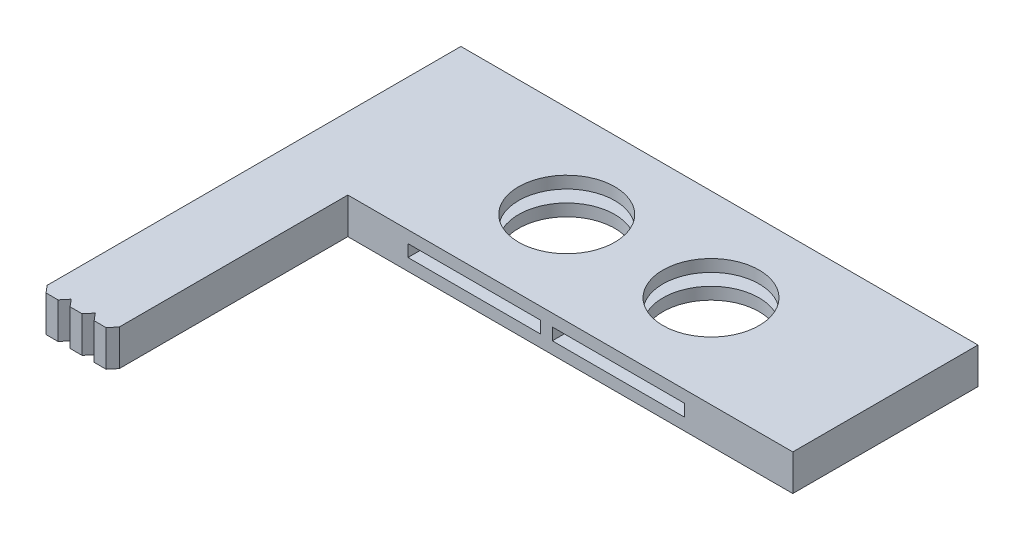
ISO-10303-21;
HEADER;
FILE_DESCRIPTION(('STEP AP214'),'2;1');
FILE_NAME('part.step','',(''),(''),'','','');
FILE_SCHEMA(('AUTOMOTIVE_DESIGN { 1 0 10303 214 1 1 1 1 }'));
ENDSEC;
DATA;
#1=APPLICATION_CONTEXT('core data for automotive mechanical design processes');
#2=APPLICATION_PROTOCOL_DEFINITION('international standard','automotive_design',2000,#1);
#3=PRODUCT_CONTEXT('',#1,'mechanical');
#4=PRODUCT('Part','Part','',(#3));
#5=PRODUCT_RELATED_PRODUCT_CATEGORY('part','',(#4));
#6=PRODUCT_DEFINITION_FORMATION('','',#4);
#7=PRODUCT_DEFINITION_CONTEXT('part definition',#1,'design');
#8=PRODUCT_DEFINITION('design','',#6,#7);
#9=PRODUCT_DEFINITION_SHAPE('','',#8);
#10=(LENGTH_UNIT() NAMED_UNIT(*) SI_UNIT(.MILLI.,.METRE.));
#11=(NAMED_UNIT(*) PLANE_ANGLE_UNIT() SI_UNIT($,.RADIAN.));
#12=(NAMED_UNIT(*) SI_UNIT($,.STERADIAN.) SOLID_ANGLE_UNIT());
#13=UNCERTAINTY_MEASURE_WITH_UNIT(LENGTH_MEASURE(1.E-05),#10,'distance_accuracy_value','');
#14=(GEOMETRIC_REPRESENTATION_CONTEXT(3) GLOBAL_UNCERTAINTY_ASSIGNED_CONTEXT((#13)) GLOBAL_UNIT_ASSIGNED_CONTEXT((#10,
#11,#12)) REPRESENTATION_CONTEXT('',''));
#15=CARTESIAN_POINT('',(0.,0.,0.));
#16=DIRECTION('',(0.,0.,1.));
#17=DIRECTION('',(1.,0.,0.));
#18=AXIS2_PLACEMENT_3D('',#15,#16,#17);
#19=CARTESIAN_POINT('',(16.5,3.,0.));
#20=DIRECTION('',(0.,-1.,0.));
#21=DIRECTION('',(0.,0.,-1.));
#22=AXIS2_PLACEMENT_3D('',#19,#20,#21);
#23=CYLINDRICAL_SURFACE('',#22,4.);
#24=CARTESIAN_POINT('',(16.5,2.,0.));
#25=DIRECTION('',(0.,1.,0.));
#26=DIRECTION('',(-1.,0.,0.));
#27=AXIS2_PLACEMENT_3D('',#24,#25,#26);
#28=CIRCLE('',#27,4.);
#29=CARTESIAN_POINT('',(12.5,2.,0.));
#30=VERTEX_POINT('',#29);
#31=EDGE_CURVE('E38',#30,#30,#28,.T.);
#32=ORIENTED_EDGE('',*,*,#31,.F.);
#33=EDGE_LOOP('',(#32));
#34=FACE_BOUND('',#33,.T.);
#35=CARTESIAN_POINT('',(16.5,3.,0.));
#36=DIRECTION('',(0.,1.,0.));
#37=DIRECTION('',(0.,0.,1.));
#38=AXIS2_PLACEMENT_3D('',#35,#36,#37);
#39=CIRCLE('',#38,4.);
#40=CARTESIAN_POINT('',(16.5,3.,4.));
#41=VERTEX_POINT('',#40);
#42=EDGE_CURVE('E255',#41,#41,#39,.T.);
#43=ORIENTED_EDGE('',*,*,#42,.T.);
#44=EDGE_LOOP('',(#43));
#45=FACE_BOUND('',#44,.T.);
#46=ADVANCED_FACE('F34',(#34,#45),#23,.F.);
#47=CARTESIAN_POINT('',(28.5,3.,0.));
#48=DIRECTION('',(0.,-1.,0.));
#49=DIRECTION('',(0.,0.,-1.));
#50=AXIS2_PLACEMENT_3D('',#47,#48,#49);
#51=CYLINDRICAL_SURFACE('',#50,4.);
#52=CARTESIAN_POINT('',(28.5,2.,0.));
#53=DIRECTION('',(0.,1.,0.));
#54=DIRECTION('',(-1.,0.,0.));
#55=AXIS2_PLACEMENT_3D('',#52,#53,#54);
#56=CIRCLE('',#55,4.);
#57=CARTESIAN_POINT('',(24.5,2.,0.));
#58=VERTEX_POINT('',#57);
#59=EDGE_CURVE('E358',#58,#58,#56,.T.);
#60=ORIENTED_EDGE('',*,*,#59,.F.);
#61=EDGE_LOOP('',(#60));
#62=FACE_BOUND('',#61,.T.);
#63=CARTESIAN_POINT('',(28.5,3.,0.));
#64=DIRECTION('',(0.,1.,0.));
#65=DIRECTION('',(0.,0.,1.));
#66=AXIS2_PLACEMENT_3D('',#63,#64,#65);
#67=CIRCLE('',#66,4.);
#68=CARTESIAN_POINT('',(28.5,3.,4.));
#69=VERTEX_POINT('',#68);
#70=EDGE_CURVE('E248',#69,#69,#67,.T.);
#71=ORIENTED_EDGE('',*,*,#70,.T.);
#72=EDGE_LOOP('',(#71));
#73=FACE_BOUND('',#72,.T.);
#74=ADVANCED_FACE('F372',(#62,#73),#51,.F.);
#75=CARTESIAN_POINT('',(0.,3.,0.));
#76=DIRECTION('',(0.,1.,0.));
#77=DIRECTION('',(0.,0.,1.));
#78=AXIS2_PLACEMENT_3D('',#75,#76,#77);
#79=PLANE('',#78);
#80=ORIENTED_EDGE('',*,*,#42,.F.);
#81=EDGE_LOOP('',(#80));
#82=FACE_BOUND('',#81,.T.);
#83=DIRECTION('',(-1.,0.,0.));
#84=VECTOR('',#83,1.);
#85=CARTESIAN_POINT('',(43.,3.,-7.7));
#86=LINE('',#85,#84);
#87=CARTESIAN_POINT('',(43.,3.,-7.7));
#88=VERTEX_POINT('',#87);
#89=CARTESIAN_POINT('',(0.,3.,-7.69999999999999));
#90=VERTEX_POINT('',#89);
#91=EDGE_CURVE('E261',#88,#90,#86,.T.);
#92=ORIENTED_EDGE('',*,*,#91,.T.);
#93=DIRECTION('',(0.,0.,1.));
#94=VECTOR('',#93,1.);
#95=CARTESIAN_POINT('',(0.,3.,-7.69999999999999));
#96=LINE('',#95,#94);
#97=CARTESIAN_POINT('',(0.,3.,26.7));
#98=VERTEX_POINT('',#97);
#99=EDGE_CURVE('E264',#90,#98,#96,.T.);
#100=ORIENTED_EDGE('',*,*,#99,.T.);
#101=DIRECTION('',(0.640868523132756,0.,0.76765066016883));
#102=VECTOR('',#101,1.);
#103=CARTESIAN_POINT('',(0.,3.,26.7));
#104=LINE('',#103,#102);
#105=CARTESIAN_POINT('',(0.500906380768423,3.,27.3));
#106=VERTEX_POINT('',#105);
#107=EDGE_CURVE('E267',#98,#106,#104,.T.);
#108=ORIENTED_EDGE('',*,*,#107,.T.);
#109=DIRECTION('',(1.,0.,0.));
#110=VECTOR('',#109,1.);
#111=CARTESIAN_POINT('',(0.500906380768423,3.,27.3));
#112=LINE('',#111,#110);
#113=CARTESIAN_POINT('',(1.49909361923161,3.,27.3));
#114=VERTEX_POINT('',#113);
#115=EDGE_CURVE('E269',#106,#114,#112,.T.);
#116=ORIENTED_EDGE('',*,*,#115,.T.);
#117=DIRECTION('',(0.640868523132743,0.,-0.76765066016884));
#118=VECTOR('',#117,1.);
#119=CARTESIAN_POINT('',(2.00000000000001,3.,26.7));
#120=LINE('',#119,#118);
#121=CARTESIAN_POINT('',(2.00000000000001,3.,26.7));
#122=VERTEX_POINT('',#121);
#123=EDGE_CURVE('E271',#114,#122,#120,.T.);
#124=ORIENTED_EDGE('',*,*,#123,.T.);
#125=DIRECTION('',(0.640868523132738,0.,0.767650660168845));
#126=VECTOR('',#125,1.);
#127=CARTESIAN_POINT('',(2.00000000000001,3.,26.7));
#128=LINE('',#127,#126);
#129=CARTESIAN_POINT('',(2.50090638076841,3.,27.3));
#130=VERTEX_POINT('',#129);
#131=EDGE_CURVE('E273',#122,#130,#128,.T.);
#132=ORIENTED_EDGE('',*,*,#131,.T.);
#133=DIRECTION('',(1.,0.,0.));
#134=VECTOR('',#133,1.);
#135=CARTESIAN_POINT('',(2.50090638076841,3.,27.3));
#136=LINE('',#135,#134);
#137=CARTESIAN_POINT('',(3.49909361923159,3.,27.3));
#138=VERTEX_POINT('',#137);
#139=EDGE_CURVE('E275',#130,#138,#136,.T.);
#140=ORIENTED_EDGE('',*,*,#139,.T.);
#141=DIRECTION('',(0.64086852313275,0.,-0.767650660168835));
#142=VECTOR('',#141,1.);
#143=CARTESIAN_POINT('',(4.00000000000001,3.,26.7));
#144=LINE('',#143,#142);
#145=CARTESIAN_POINT('',(4.00000000000001,3.,26.7));
#146=VERTEX_POINT('',#145);
#147=EDGE_CURVE('E277',#138,#146,#144,.T.);
#148=ORIENTED_EDGE('',*,*,#147,.T.);
#149=DIRECTION('',(0.640868523132732,0.,0.76765066016885));
#150=VECTOR('',#149,1.);
#151=CARTESIAN_POINT('',(4.00000000000001,3.,26.7));
#152=LINE('',#151,#150);
#153=CARTESIAN_POINT('',(4.50090638076839,3.,27.3));
#154=VERTEX_POINT('',#153);
#155=EDGE_CURVE('E279',#146,#154,#152,.T.);
#156=ORIENTED_EDGE('',*,*,#155,.T.);
#157=DIRECTION('',(1.,0.,0.));
#158=VECTOR('',#157,1.);
#159=CARTESIAN_POINT('',(4.50090638076839,3.,27.3));
#160=LINE('',#159,#158);
#161=CARTESIAN_POINT('',(5.49909361923158,3.,27.3));
#162=VERTEX_POINT('',#161);
#163=EDGE_CURVE('E281',#154,#162,#160,.T.);
#164=ORIENTED_EDGE('',*,*,#163,.T.);
#165=DIRECTION('',(0.640868523132743,0.,-0.76765066016884));
#166=VECTOR('',#165,1.);
#167=CARTESIAN_POINT('',(5.99999999999998,3.,26.7));
#168=LINE('',#167,#166);
#169=CARTESIAN_POINT('',(5.99999999999998,3.,26.7));
#170=VERTEX_POINT('',#169);
#171=EDGE_CURVE('E283',#162,#170,#168,.T.);
#172=ORIENTED_EDGE('',*,*,#171,.T.);
#173=DIRECTION('',(0.,0.,-1.));
#174=VECTOR('',#173,1.);
#175=CARTESIAN_POINT('',(5.99999999999998,3.,26.7));
#176=LINE('',#175,#174);
#177=CARTESIAN_POINT('',(5.99999999999998,3.,7.7));
#178=VERTEX_POINT('',#177);
#179=EDGE_CURVE('E285',#170,#178,#176,.T.);
#180=ORIENTED_EDGE('',*,*,#179,.T.);
#181=DIRECTION('',(1.,0.,0.));
#182=VECTOR('',#181,1.);
#183=CARTESIAN_POINT('',(5.99999999999998,3.,7.7));
#184=LINE('',#183,#182);
#185=CARTESIAN_POINT('',(43.,3.,7.7));
#186=VERTEX_POINT('',#185);
#187=EDGE_CURVE('E287',#178,#186,#184,.T.);
#188=ORIENTED_EDGE('',*,*,#187,.T.);
#189=DIRECTION('',(0.,0.,-1.));
#190=VECTOR('',#189,1.);
#191=CARTESIAN_POINT('',(43.,3.,-7.7));
#192=LINE('',#191,#190);
#193=EDGE_CURVE('E289',#186,#88,#192,.T.);
#194=ORIENTED_EDGE('',*,*,#193,.T.);
#195=EDGE_LOOP('',(#92,#100,#108,#116,#124,#132,#140,#148,#156,#164,#172,#180,#188,#194));
#196=FACE_BOUND('',#195,.T.);
#197=ORIENTED_EDGE('',*,*,#70,.F.);
#198=EDGE_LOOP('',(#197));
#199=FACE_BOUND('',#198,.T.);
#200=ADVANCED_FACE('F377',(#82,#196,#199),#79,.T.);
#201=CARTESIAN_POINT('',(0.,0.,0.));
#202=DIRECTION('',(0.,1.,0.));
#203=DIRECTION('',(0.,0.,1.));
#204=AXIS2_PLACEMENT_3D('',#201,#202,#203);
#205=PLANE('',#204);
#206=DIRECTION('',(-1.,0.,0.));
#207=VECTOR('',#206,1.);
#208=CARTESIAN_POINT('',(43.,0.,-7.7));
#209=LINE('',#208,#207);
#210=CARTESIAN_POINT('',(43.,0.,-7.7));
#211=VERTEX_POINT('',#210);
#212=CARTESIAN_POINT('',(0.,0.,-7.69999999999999));
#213=VERTEX_POINT('',#212);
#214=EDGE_CURVE('E258',#211,#213,#209,.T.);
#215=ORIENTED_EDGE('',*,*,#214,.F.);
#216=DIRECTION('',(0.,0.,-1.));
#217=VECTOR('',#216,1.);
#218=CARTESIAN_POINT('',(43.,0.,-7.7));
#219=LINE('',#218,#217);
#220=CARTESIAN_POINT('',(43.,0.,7.7));
#221=VERTEX_POINT('',#220);
#222=EDGE_CURVE('E265',#221,#211,#219,.T.);
#223=ORIENTED_EDGE('',*,*,#222,.F.);
#224=DIRECTION('',(1.,0.,0.));
#225=VECTOR('',#224,1.);
#226=CARTESIAN_POINT('',(5.99999999999998,0.,7.7));
#227=LINE('',#226,#225);
#228=CARTESIAN_POINT('',(5.99999999999998,0.,7.7));
#229=VERTEX_POINT('',#228);
#230=EDGE_CURVE('E316',#229,#221,#227,.T.);
#231=ORIENTED_EDGE('',*,*,#230,.F.);
#232=DIRECTION('',(0.,0.,-1.));
#233=VECTOR('',#232,1.);
#234=CARTESIAN_POINT('',(5.99999999999998,0.,26.7));
#235=LINE('',#234,#233);
#236=CARTESIAN_POINT('',(5.99999999999998,0.,26.7));
#237=VERTEX_POINT('',#236);
#238=EDGE_CURVE('E314',#237,#229,#235,.T.);
#239=ORIENTED_EDGE('',*,*,#238,.F.);
#240=DIRECTION('',(0.640868523132743,0.,-0.76765066016884));
#241=VECTOR('',#240,1.);
#242=CARTESIAN_POINT('',(5.99999999999998,0.,26.7));
#243=LINE('',#242,#241);
#244=CARTESIAN_POINT('',(5.49909361923158,0.,27.3));
#245=VERTEX_POINT('',#244);
#246=EDGE_CURVE('E312',#245,#237,#243,.T.);
#247=ORIENTED_EDGE('',*,*,#246,.F.);
#248=DIRECTION('',(1.,0.,0.));
#249=VECTOR('',#248,1.);
#250=CARTESIAN_POINT('',(4.50090638076839,0.,27.3));
#251=LINE('',#250,#249);
#252=CARTESIAN_POINT('',(4.50090638076839,0.,27.3));
#253=VERTEX_POINT('',#252);
#254=EDGE_CURVE('E310',#253,#245,#251,.T.);
#255=ORIENTED_EDGE('',*,*,#254,.F.);
#256=DIRECTION('',(0.640868523132732,0.,0.76765066016885));
#257=VECTOR('',#256,1.);
#258=CARTESIAN_POINT('',(4.00000000000001,0.,26.7));
#259=LINE('',#258,#257);
#260=CARTESIAN_POINT('',(4.00000000000001,0.,26.7));
#261=VERTEX_POINT('',#260);
#262=EDGE_CURVE('E308',#261,#253,#259,.T.);
#263=ORIENTED_EDGE('',*,*,#262,.F.);
#264=DIRECTION('',(0.64086852313275,0.,-0.767650660168835));
#265=VECTOR('',#264,1.);
#266=CARTESIAN_POINT('',(4.00000000000001,0.,26.7));
#267=LINE('',#266,#265);
#268=CARTESIAN_POINT('',(3.49909361923159,0.,27.3));
#269=VERTEX_POINT('',#268);
#270=EDGE_CURVE('E306',#269,#261,#267,.T.);
#271=ORIENTED_EDGE('',*,*,#270,.F.);
#272=DIRECTION('',(1.,0.,0.));
#273=VECTOR('',#272,1.);
#274=CARTESIAN_POINT('',(2.50090638076841,0.,27.3));
#275=LINE('',#274,#273);
#276=CARTESIAN_POINT('',(2.50090638076841,0.,27.3));
#277=VERTEX_POINT('',#276);
#278=EDGE_CURVE('E304',#277,#269,#275,.T.);
#279=ORIENTED_EDGE('',*,*,#278,.F.);
#280=DIRECTION('',(0.640868523132738,0.,0.767650660168845));
#281=VECTOR('',#280,1.);
#282=CARTESIAN_POINT('',(2.00000000000001,0.,26.7));
#283=LINE('',#282,#281);
#284=CARTESIAN_POINT('',(2.00000000000001,0.,26.7));
#285=VERTEX_POINT('',#284);
#286=EDGE_CURVE('E302',#285,#277,#283,.T.);
#287=ORIENTED_EDGE('',*,*,#286,.F.);
#288=DIRECTION('',(0.640868523132743,0.,-0.76765066016884));
#289=VECTOR('',#288,1.);
#290=CARTESIAN_POINT('',(2.00000000000001,0.,26.7));
#291=LINE('',#290,#289);
#292=CARTESIAN_POINT('',(1.49909361923161,0.,27.3));
#293=VERTEX_POINT('',#292);
#294=EDGE_CURVE('E300',#293,#285,#291,.T.);
#295=ORIENTED_EDGE('',*,*,#294,.F.);
#296=DIRECTION('',(1.,0.,0.));
#297=VECTOR('',#296,1.);
#298=CARTESIAN_POINT('',(0.500906380768423,0.,27.3));
#299=LINE('',#298,#297);
#300=CARTESIAN_POINT('',(0.500906380768423,0.,27.3));
#301=VERTEX_POINT('',#300);
#302=EDGE_CURVE('E298',#301,#293,#299,.T.);
#303=ORIENTED_EDGE('',*,*,#302,.F.);
#304=DIRECTION('',(0.640868523132756,0.,0.76765066016883));
#305=VECTOR('',#304,1.);
#306=CARTESIAN_POINT('',(0.,0.,26.7));
#307=LINE('',#306,#305);
#308=CARTESIAN_POINT('',(0.,0.,26.7));
#309=VERTEX_POINT('',#308);
#310=EDGE_CURVE('E296',#309,#301,#307,.T.);
#311=ORIENTED_EDGE('',*,*,#310,.F.);
#312=DIRECTION('',(0.,0.,1.));
#313=VECTOR('',#312,1.);
#314=CARTESIAN_POINT('',(0.,0.,-7.69999999999999));
#315=LINE('',#314,#313);
#316=EDGE_CURVE('E294',#213,#309,#315,.T.);
#317=ORIENTED_EDGE('',*,*,#316,.F.);
#318=EDGE_LOOP('',(#215,#223,#231,#239,#247,#255,#263,#271,#279,#287,#295,#303,#311,#317));
#319=FACE_BOUND('',#318,.T.);
#320=CARTESIAN_POINT('',(16.5,0.,0.));
#321=DIRECTION('',(0.,1.,0.));
#322=DIRECTION('',(0.,0.,1.));
#323=AXIS2_PLACEMENT_3D('',#320,#321,#322);
#324=CIRCLE('',#323,4.);
#325=CARTESIAN_POINT('',(16.5,0.,4.));
#326=VERTEX_POINT('',#325);
#327=EDGE_CURVE('E251',#326,#326,#324,.T.);
#328=ORIENTED_EDGE('',*,*,#327,.T.);
#329=EDGE_LOOP('',(#328));
#330=FACE_BOUND('',#329,.T.);
#331=CARTESIAN_POINT('',(28.5,0.,0.));
#332=DIRECTION('',(0.,1.,0.));
#333=DIRECTION('',(0.,0.,1.));
#334=AXIS2_PLACEMENT_3D('',#331,#332,#333);
#335=CIRCLE('',#334,4.);
#336=CARTESIAN_POINT('',(28.5,0.,4.));
#337=VERTEX_POINT('',#336);
#338=EDGE_CURVE('E252',#337,#337,#335,.T.);
#339=ORIENTED_EDGE('',*,*,#338,.T.);
#340=EDGE_LOOP('',(#339));
#341=FACE_BOUND('',#340,.T.);
#342=ADVANCED_FACE('F380',(#319,#330,#341),#205,.F.);
#343=CARTESIAN_POINT('',(43.,3.,-7.7));
#344=DIRECTION('',(0.,0.,1.));
#345=DIRECTION('',(1.,0.,0.));
#346=AXIS2_PLACEMENT_3D('',#343,#344,#345);
#347=PLANE('',#346);
#348=ORIENTED_EDGE('',*,*,#214,.T.);
#349=DIRECTION('',(0.,-1.,0.));
#350=VECTOR('',#349,1.);
#351=CARTESIAN_POINT('',(0.,3.,-7.69999999999999));
#352=LINE('',#351,#350);
#353=EDGE_CURVE('E12',#90,#213,#352,.T.);
#354=ORIENTED_EDGE('',*,*,#353,.F.);
#355=ORIENTED_EDGE('',*,*,#91,.F.);
#356=DIRECTION('',(0.,-1.,0.));
#357=VECTOR('',#356,1.);
#358=CARTESIAN_POINT('',(43.,3.,-7.7));
#359=LINE('',#358,#357);
#360=EDGE_CURVE('E291',#88,#211,#359,.T.);
#361=ORIENTED_EDGE('',*,*,#360,.T.);
#362=EDGE_LOOP('',(#348,#354,#355,#361));
#363=FACE_BOUND('',#362,.T.);
#364=ADVANCED_FACE('F36',(#363),#347,.F.);
#365=CARTESIAN_POINT('',(0.,3.,-7.69999999999999));
#366=DIRECTION('',(1.,0.,0.));
#367=DIRECTION('',(0.,0.,-1.));
#368=AXIS2_PLACEMENT_3D('',#365,#366,#367);
#369=PLANE('',#368);
#370=ORIENTED_EDGE('',*,*,#316,.T.);
#371=DIRECTION('',(0.,-1.,0.));
#372=VECTOR('',#371,1.);
#373=CARTESIAN_POINT('',(0.,3.,26.7));
#374=LINE('',#373,#372);
#375=EDGE_CURVE('E43',#98,#309,#374,.T.);
#376=ORIENTED_EDGE('',*,*,#375,.F.);
#377=ORIENTED_EDGE('',*,*,#99,.F.);
#378=ORIENTED_EDGE('',*,*,#353,.T.);
#379=EDGE_LOOP('',(#370,#376,#377,#378));
#380=FACE_BOUND('',#379,.T.);
#381=ADVANCED_FACE('F415',(#380),#369,.F.);
#382=CARTESIAN_POINT('',(0.,3.,26.7));
#383=DIRECTION('',(0.76765066016883,0.,-0.640868523132756));
#384=DIRECTION('',(-0.640868523132756,0.,-0.76765066016883));
#385=AXIS2_PLACEMENT_3D('',#382,#383,#384);
#386=PLANE('',#385);
#387=ORIENTED_EDGE('',*,*,#310,.T.);
#388=DIRECTION('',(0.,-1.,0.));
#389=VECTOR('',#388,1.);
#390=CARTESIAN_POINT('',(0.500906380768423,3.,27.3));
#391=LINE('',#390,#389);
#392=EDGE_CURVE('E351',#106,#301,#391,.T.);
#393=ORIENTED_EDGE('',*,*,#392,.F.);
#394=ORIENTED_EDGE('',*,*,#107,.F.);
#395=ORIENTED_EDGE('',*,*,#375,.T.);
#396=EDGE_LOOP('',(#387,#393,#394,#395));
#397=FACE_BOUND('',#396,.T.);
#398=ADVANCED_FACE('F460',(#397),#386,.F.);
#399=CARTESIAN_POINT('',(0.500906380768423,3.,27.3));
#400=DIRECTION('',(0.,0.,-1.));
#401=DIRECTION('',(-1.,0.,0.));
#402=AXIS2_PLACEMENT_3D('',#399,#400,#401);
#403=PLANE('',#402);
#404=ORIENTED_EDGE('',*,*,#302,.T.);
#405=DIRECTION('',(0.,-1.,0.));
#406=VECTOR('',#405,1.);
#407=CARTESIAN_POINT('',(1.49909361923161,3.,27.3));
#408=LINE('',#407,#406);
#409=EDGE_CURVE('E348',#114,#293,#408,.T.);
#410=ORIENTED_EDGE('',*,*,#409,.F.);
#411=ORIENTED_EDGE('',*,*,#115,.F.);
#412=ORIENTED_EDGE('',*,*,#392,.T.);
#413=EDGE_LOOP('',(#404,#410,#411,#412));
#414=FACE_BOUND('',#413,.T.);
#415=ADVANCED_FACE('F456',(#414),#403,.F.);
#416=CARTESIAN_POINT('',(2.00000000000001,3.,26.7));
#417=DIRECTION('',(-0.76765066016884,0.,-0.640868523132743));
#418=DIRECTION('',(-0.640868523132743,0.,0.76765066016884));
#419=AXIS2_PLACEMENT_3D('',#416,#417,#418);
#420=PLANE('',#419);
#421=ORIENTED_EDGE('',*,*,#294,.T.);
#422=DIRECTION('',(0.,-1.,0.));
#423=VECTOR('',#422,1.);
#424=CARTESIAN_POINT('',(2.00000000000001,3.,26.7));
#425=LINE('',#424,#423);
#426=EDGE_CURVE('E345',#122,#285,#425,.T.);
#427=ORIENTED_EDGE('',*,*,#426,.F.);
#428=ORIENTED_EDGE('',*,*,#123,.F.);
#429=ORIENTED_EDGE('',*,*,#409,.T.);
#430=EDGE_LOOP('',(#421,#427,#428,#429));
#431=FACE_BOUND('',#430,.T.);
#432=ADVANCED_FACE('F452',(#431),#420,.F.);
#433=CARTESIAN_POINT('',(2.00000000000001,3.,26.7));
#434=DIRECTION('',(0.767650660168845,0.,-0.640868523132738));
#435=DIRECTION('',(-0.640868523132738,0.,-0.767650660168845));
#436=AXIS2_PLACEMENT_3D('',#433,#434,#435);
#437=PLANE('',#436);
#438=ORIENTED_EDGE('',*,*,#286,.T.);
#439=DIRECTION('',(0.,-1.,0.));
#440=VECTOR('',#439,1.);
#441=CARTESIAN_POINT('',(2.50090638076841,3.,27.3));
#442=LINE('',#441,#440);
#443=EDGE_CURVE('E342',#130,#277,#442,.T.);
#444=ORIENTED_EDGE('',*,*,#443,.F.);
#445=ORIENTED_EDGE('',*,*,#131,.F.);
#446=ORIENTED_EDGE('',*,*,#426,.T.);
#447=EDGE_LOOP('',(#438,#444,#445,#446));
#448=FACE_BOUND('',#447,.T.);
#449=ADVANCED_FACE('F448',(#448),#437,.F.);
#450=CARTESIAN_POINT('',(2.50090638076841,3.,27.3));
#451=DIRECTION('',(0.,0.,-1.));
#452=DIRECTION('',(-1.,0.,0.));
#453=AXIS2_PLACEMENT_3D('',#450,#451,#452);
#454=PLANE('',#453);
#455=ORIENTED_EDGE('',*,*,#278,.T.);
#456=DIRECTION('',(0.,-1.,0.));
#457=VECTOR('',#456,1.);
#458=CARTESIAN_POINT('',(3.49909361923159,3.,27.3));
#459=LINE('',#458,#457);
#460=EDGE_CURVE('E339',#138,#269,#459,.T.);
#461=ORIENTED_EDGE('',*,*,#460,.F.);
#462=ORIENTED_EDGE('',*,*,#139,.F.);
#463=ORIENTED_EDGE('',*,*,#443,.T.);
#464=EDGE_LOOP('',(#455,#461,#462,#463));
#465=FACE_BOUND('',#464,.T.);
#466=ADVANCED_FACE('F444',(#465),#454,.F.);
#467=CARTESIAN_POINT('',(4.00000000000001,3.,26.7));
#468=DIRECTION('',(-0.767650660168835,0.,-0.64086852313275));
#469=DIRECTION('',(-0.64086852313275,0.,0.767650660168835));
#470=AXIS2_PLACEMENT_3D('',#467,#468,#469);
#471=PLANE('',#470);
#472=ORIENTED_EDGE('',*,*,#270,.T.);
#473=DIRECTION('',(0.,-1.,0.));
#474=VECTOR('',#473,1.);
#475=CARTESIAN_POINT('',(4.00000000000001,3.,26.7));
#476=LINE('',#475,#474);
#477=EDGE_CURVE('E336',#146,#261,#476,.T.);
#478=ORIENTED_EDGE('',*,*,#477,.F.);
#479=ORIENTED_EDGE('',*,*,#147,.F.);
#480=ORIENTED_EDGE('',*,*,#460,.T.);
#481=EDGE_LOOP('',(#472,#478,#479,#480));
#482=FACE_BOUND('',#481,.T.);
#483=ADVANCED_FACE('F440',(#482),#471,.F.);
#484=CARTESIAN_POINT('',(4.00000000000001,3.,26.7));
#485=DIRECTION('',(0.76765066016885,0.,-0.640868523132732));
#486=DIRECTION('',(-0.640868523132732,0.,-0.76765066016885));
#487=AXIS2_PLACEMENT_3D('',#484,#485,#486);
#488=PLANE('',#487);
#489=ORIENTED_EDGE('',*,*,#262,.T.);
#490=DIRECTION('',(0.,-1.,0.));
#491=VECTOR('',#490,1.);
#492=CARTESIAN_POINT('',(4.50090638076839,3.,27.3));
#493=LINE('',#492,#491);
#494=EDGE_CURVE('E333',#154,#253,#493,.T.);
#495=ORIENTED_EDGE('',*,*,#494,.F.);
#496=ORIENTED_EDGE('',*,*,#155,.F.);
#497=ORIENTED_EDGE('',*,*,#477,.T.);
#498=EDGE_LOOP('',(#489,#495,#496,#497));
#499=FACE_BOUND('',#498,.T.);
#500=ADVANCED_FACE('F436',(#499),#488,.F.);
#501=CARTESIAN_POINT('',(4.50090638076839,3.,27.3));
#502=DIRECTION('',(0.,0.,-1.));
#503=DIRECTION('',(-1.,0.,0.));
#504=AXIS2_PLACEMENT_3D('',#501,#502,#503);
#505=PLANE('',#504);
#506=ORIENTED_EDGE('',*,*,#254,.T.);
#507=DIRECTION('',(0.,-1.,0.));
#508=VECTOR('',#507,1.);
#509=CARTESIAN_POINT('',(5.49909361923158,3.,27.3));
#510=LINE('',#509,#508);
#511=EDGE_CURVE('E330',#162,#245,#510,.T.);
#512=ORIENTED_EDGE('',*,*,#511,.F.);
#513=ORIENTED_EDGE('',*,*,#163,.F.);
#514=ORIENTED_EDGE('',*,*,#494,.T.);
#515=EDGE_LOOP('',(#506,#512,#513,#514));
#516=FACE_BOUND('',#515,.T.);
#517=ADVANCED_FACE('F432',(#516),#505,.F.);
#518=CARTESIAN_POINT('',(5.99999999999998,3.,26.7));
#519=DIRECTION('',(-0.76765066016884,0.,-0.640868523132743));
#520=DIRECTION('',(-0.640868523132743,0.,0.76765066016884));
#521=AXIS2_PLACEMENT_3D('',#518,#519,#520);
#522=PLANE('',#521);
#523=ORIENTED_EDGE('',*,*,#246,.T.);
#524=DIRECTION('',(0.,-1.,0.));
#525=VECTOR('',#524,1.);
#526=CARTESIAN_POINT('',(5.99999999999998,3.,26.7));
#527=LINE('',#526,#525);
#528=EDGE_CURVE('E327',#170,#237,#527,.T.);
#529=ORIENTED_EDGE('',*,*,#528,.F.);
#530=ORIENTED_EDGE('',*,*,#171,.F.);
#531=ORIENTED_EDGE('',*,*,#511,.T.);
#532=EDGE_LOOP('',(#523,#529,#530,#531));
#533=FACE_BOUND('',#532,.T.);
#534=ADVANCED_FACE('F428',(#533),#522,.F.);
#535=CARTESIAN_POINT('',(5.99999999999998,3.,26.7));
#536=DIRECTION('',(-1.,0.,0.));
#537=DIRECTION('',(0.,0.,1.));
#538=AXIS2_PLACEMENT_3D('',#535,#536,#537);
#539=PLANE('',#538);
#540=ORIENTED_EDGE('',*,*,#238,.T.);
#541=DIRECTION('',(0.,-1.,0.));
#542=VECTOR('',#541,1.);
#543=CARTESIAN_POINT('',(5.99999999999998,3.,7.7));
#544=LINE('',#543,#542);
#545=EDGE_CURVE('E324',#178,#229,#544,.T.);
#546=ORIENTED_EDGE('',*,*,#545,.F.);
#547=ORIENTED_EDGE('',*,*,#179,.F.);
#548=ORIENTED_EDGE('',*,*,#528,.T.);
#549=EDGE_LOOP('',(#540,#546,#547,#548));
#550=FACE_BOUND('',#549,.T.);
#551=ADVANCED_FACE('F425',(#550),#539,.F.);
#552=CARTESIAN_POINT('',(5.99999999999998,3.,7.7));
#553=DIRECTION('',(0.,0.,-1.));
#554=DIRECTION('',(-1.,0.,0.));
#555=AXIS2_PLACEMENT_3D('',#552,#553,#554);
#556=PLANE('',#555);
#557=DIRECTION('',(1.,0.,0.));
#558=VECTOR('',#557,1.);
#559=CARTESIAN_POINT('',(11.,1.,7.7));
#560=LINE('',#559,#558);
#561=CARTESIAN_POINT('',(11.,1.,7.7));
#562=VERTEX_POINT('',#561);
#563=CARTESIAN_POINT('',(22.,1.,7.7));
#564=VERTEX_POINT('',#563);
#565=EDGE_CURVE('E202',#562,#564,#560,.T.);
#566=ORIENTED_EDGE('',*,*,#565,.F.);
#567=DIRECTION('',(0.,-1.,0.));
#568=VECTOR('',#567,1.);
#569=CARTESIAN_POINT('',(11.,2.,7.7));
#570=LINE('',#569,#568);
#571=CARTESIAN_POINT('',(11.,2.,7.7));
#572=VERTEX_POINT('',#571);
#573=EDGE_CURVE('E51',#572,#562,#570,.T.);
#574=ORIENTED_EDGE('',*,*,#573,.F.);
#575=DIRECTION('',(-1.,0.,0.));
#576=VECTOR('',#575,1.);
#577=CARTESIAN_POINT('',(11.,2.,7.7));
#578=LINE('',#577,#576);
#579=CARTESIAN_POINT('',(22.,2.,7.7));
#580=VERTEX_POINT('',#579);
#581=EDGE_CURVE('E209',#580,#572,#578,.T.);
#582=ORIENTED_EDGE('',*,*,#581,.F.);
#583=DIRECTION('',(0.,1.,0.));
#584=VECTOR('',#583,1.);
#585=CARTESIAN_POINT('',(22.,2.,7.7));
#586=LINE('',#585,#584);
#587=EDGE_CURVE('E192',#564,#580,#586,.T.);
#588=ORIENTED_EDGE('',*,*,#587,.F.);
#589=EDGE_LOOP('',(#566,#574,#582,#588));
#590=FACE_BOUND('',#589,.T.);
#591=DIRECTION('',(1.,0.,0.));
#592=VECTOR('',#591,1.);
#593=CARTESIAN_POINT('',(23.,1.,7.7));
#594=LINE('',#593,#592);
#595=CARTESIAN_POINT('',(23.,1.,7.7));
#596=VERTEX_POINT('',#595);
#597=CARTESIAN_POINT('',(34.,1.,7.7));
#598=VERTEX_POINT('',#597);
#599=EDGE_CURVE('E231',#596,#598,#594,.T.);
#600=ORIENTED_EDGE('',*,*,#599,.F.);
#601=DIRECTION('',(0.,-1.,0.));
#602=VECTOR('',#601,1.);
#603=CARTESIAN_POINT('',(23.,2.,7.7));
#604=LINE('',#603,#602);
#605=CARTESIAN_POINT('',(23.,2.,7.7));
#606=VERTEX_POINT('',#605);
#607=EDGE_CURVE('E59',#606,#596,#604,.T.);
#608=ORIENTED_EDGE('',*,*,#607,.F.);
#609=DIRECTION('',(-1.,0.,0.));
#610=VECTOR('',#609,1.);
#611=CARTESIAN_POINT('',(23.,2.,7.7));
#612=LINE('',#611,#610);
#613=CARTESIAN_POINT('',(34.,2.,7.7));
#614=VERTEX_POINT('',#613);
#615=EDGE_CURVE('E237',#614,#606,#612,.T.);
#616=ORIENTED_EDGE('',*,*,#615,.F.);
#617=DIRECTION('',(0.,1.,0.));
#618=VECTOR('',#617,1.);
#619=CARTESIAN_POINT('',(34.,2.,7.7));
#620=LINE('',#619,#618);
#621=EDGE_CURVE('E234',#598,#614,#620,.T.);
#622=ORIENTED_EDGE('',*,*,#621,.F.);
#623=EDGE_LOOP('',(#600,#608,#616,#622));
#624=FACE_BOUND('',#623,.T.);
#625=ORIENTED_EDGE('',*,*,#230,.T.);
#626=DIRECTION('',(0.,-1.,0.));
#627=VECTOR('',#626,1.);
#628=CARTESIAN_POINT('',(43.,3.,7.7));
#629=LINE('',#628,#627);
#630=EDGE_CURVE('E321',#186,#221,#629,.T.);
#631=ORIENTED_EDGE('',*,*,#630,.F.);
#632=ORIENTED_EDGE('',*,*,#187,.F.);
#633=ORIENTED_EDGE('',*,*,#545,.T.);
#634=EDGE_LOOP('',(#625,#631,#632,#633));
#635=FACE_BOUND('',#634,.T.);
#636=ADVANCED_FACE('F206',(#590,#624,#635),#556,.F.);
#637=CARTESIAN_POINT('',(43.,3.,-7.7));
#638=DIRECTION('',(-1.,0.,0.));
#639=DIRECTION('',(0.,0.,1.));
#640=AXIS2_PLACEMENT_3D('',#637,#638,#639);
#641=PLANE('',#640);
#642=ORIENTED_EDGE('',*,*,#222,.T.);
#643=ORIENTED_EDGE('',*,*,#360,.F.);
#644=ORIENTED_EDGE('',*,*,#193,.F.);
#645=ORIENTED_EDGE('',*,*,#630,.T.);
#646=EDGE_LOOP('',(#642,#643,#644,#645));
#647=FACE_BOUND('',#646,.T.);
#648=ADVANCED_FACE('F403',(#647),#641,.F.);
#649=CARTESIAN_POINT('',(16.5,1.,0.));
#650=DIRECTION('',(0.,-1.,0.));
#651=DIRECTION('',(1.,0.,0.));
#652=AXIS2_PLACEMENT_3D('',#649,#650,#651);
#653=CIRCLE('',#652,4.);
#654=CARTESIAN_POINT('',(20.5,1.,0.));
#655=VERTEX_POINT('',#654);
#656=EDGE_CURVE('E360',#655,#655,#653,.T.);
#657=ORIENTED_EDGE('',*,*,#656,.F.);
#658=EDGE_LOOP('',(#657));
#659=FACE_BOUND('',#658,.T.);
#660=ORIENTED_EDGE('',*,*,#327,.F.);
#661=EDGE_LOOP('',(#660));
#662=FACE_BOUND('',#661,.T.);
#663=ADVANCED_FACE('F374',(#659,#662),#23,.F.);
#664=CARTESIAN_POINT('',(28.5,1.,0.));
#665=DIRECTION('',(0.,-1.,0.));
#666=DIRECTION('',(1.,0.,0.));
#667=AXIS2_PLACEMENT_3D('',#664,#665,#666);
#668=CIRCLE('',#667,4.);
#669=CARTESIAN_POINT('',(32.5,1.,0.));
#670=VERTEX_POINT('',#669);
#671=EDGE_CURVE('E220',#670,#670,#668,.T.);
#672=ORIENTED_EDGE('',*,*,#671,.F.);
#673=EDGE_LOOP('',(#672));
#674=FACE_BOUND('',#673,.T.);
#675=ORIENTED_EDGE('',*,*,#338,.F.);
#676=EDGE_LOOP('',(#675));
#677=FACE_BOUND('',#676,.T.);
#678=ADVANCED_FACE('F390',(#674,#677),#51,.F.);
#679=CARTESIAN_POINT('',(23.,2.,-18.7453610171872));
#680=DIRECTION('',(-1.,0.,0.));
#681=DIRECTION('',(0.,0.,1.));
#682=AXIS2_PLACEMENT_3D('',#679,#680,#681);
#683=PLANE('',#682);
#684=DIRECTION('',(0.,1.,0.));
#685=VECTOR('',#684,1.);
#686=CARTESIAN_POINT('',(23.,2.,-5.7));
#687=LINE('',#686,#685);
#688=CARTESIAN_POINT('',(23.,1.,-5.7));
#689=VERTEX_POINT('',#688);
#690=CARTESIAN_POINT('',(23.,2.,-5.7));
#691=VERTEX_POINT('',#690);
#692=EDGE_CURVE('E227',#689,#691,#687,.T.);
#693=ORIENTED_EDGE('',*,*,#692,.T.);
#694=DIRECTION('',(0.,0.,1.));
#695=VECTOR('',#694,1.);
#696=CARTESIAN_POINT('',(23.,2.,-18.7453610171872));
#697=LINE('',#696,#695);
#698=EDGE_CURVE('E225',#691,#606,#697,.T.);
#699=ORIENTED_EDGE('',*,*,#698,.T.);
#700=ORIENTED_EDGE('',*,*,#607,.T.);
#701=DIRECTION('',(0.,0.,1.));
#702=VECTOR('',#701,1.);
#703=CARTESIAN_POINT('',(23.,1.,-18.7453610171872));
#704=LINE('',#703,#702);
#705=EDGE_CURVE('E240',#689,#596,#704,.T.);
#706=ORIENTED_EDGE('',*,*,#705,.F.);
#707=EDGE_LOOP('',(#693,#699,#700,#706));
#708=FACE_BOUND('',#707,.T.);
#709=ADVANCED_FACE('F396',(#708),#683,.F.);
#710=CARTESIAN_POINT('',(23.,2.,-18.7453610171872));
#711=DIRECTION('',(0.,1.,0.));
#712=DIRECTION('',(-1.,0.,0.));
#713=AXIS2_PLACEMENT_3D('',#710,#711,#712);
#714=PLANE('',#713);
#715=ORIENTED_EDGE('',*,*,#59,.T.);
#716=EDGE_LOOP('',(#715));
#717=FACE_BOUND('',#716,.T.);
#718=DIRECTION('',(1.,0.,0.));
#719=VECTOR('',#718,1.);
#720=CARTESIAN_POINT('',(23.,2.,-5.7));
#721=LINE('',#720,#719);
#722=CARTESIAN_POINT('',(34.,2.,-5.7));
#723=VERTEX_POINT('',#722);
#724=EDGE_CURVE('E224',#691,#723,#721,.T.);
#725=ORIENTED_EDGE('',*,*,#724,.T.);
#726=DIRECTION('',(0.,0.,1.));
#727=VECTOR('',#726,1.);
#728=CARTESIAN_POINT('',(34.,2.,-18.7453610171872));
#729=LINE('',#728,#727);
#730=EDGE_CURVE('E242',#723,#614,#729,.T.);
#731=ORIENTED_EDGE('',*,*,#730,.T.);
#732=ORIENTED_EDGE('',*,*,#615,.T.);
#733=ORIENTED_EDGE('',*,*,#698,.F.);
#734=EDGE_LOOP('',(#725,#731,#732,#733));
#735=FACE_BOUND('',#734,.T.);
#736=ADVANCED_FACE('F402',(#717,#735),#714,.F.);
#737=CARTESIAN_POINT('',(34.,2.,-18.7453610171872));
#738=DIRECTION('',(1.,0.,0.));
#739=DIRECTION('',(0.,0.,-1.));
#740=AXIS2_PLACEMENT_3D('',#737,#738,#739);
#741=PLANE('',#740);
#742=DIRECTION('',(0.,-1.,0.));
#743=VECTOR('',#742,1.);
#744=CARTESIAN_POINT('',(34.,2.,-5.7));
#745=LINE('',#744,#743);
#746=CARTESIAN_POINT('',(34.,1.,-5.7));
#747=VERTEX_POINT('',#746);
#748=EDGE_CURVE('E222',#723,#747,#745,.T.);
#749=ORIENTED_EDGE('',*,*,#748,.T.);
#750=DIRECTION('',(0.,0.,1.));
#751=VECTOR('',#750,1.);
#752=CARTESIAN_POINT('',(34.,1.,-18.7453610171872));
#753=LINE('',#752,#751);
#754=EDGE_CURVE('E244',#747,#598,#753,.T.);
#755=ORIENTED_EDGE('',*,*,#754,.T.);
#756=ORIENTED_EDGE('',*,*,#621,.T.);
#757=ORIENTED_EDGE('',*,*,#730,.F.);
#758=EDGE_LOOP('',(#749,#755,#756,#757));
#759=FACE_BOUND('',#758,.T.);
#760=ADVANCED_FACE('F582',(#759),#741,.F.);
#761=CARTESIAN_POINT('',(23.,1.,-18.7453610171872));
#762=DIRECTION('',(0.,-1.,0.));
#763=DIRECTION('',(1.,0.,0.));
#764=AXIS2_PLACEMENT_3D('',#761,#762,#763);
#765=PLANE('',#764);
#766=ORIENTED_EDGE('',*,*,#671,.T.);
#767=EDGE_LOOP('',(#766));
#768=FACE_BOUND('',#767,.T.);
#769=DIRECTION('',(-1.,0.,0.));
#770=VECTOR('',#769,1.);
#771=CARTESIAN_POINT('',(23.,1.,-5.7));
#772=LINE('',#771,#770);
#773=EDGE_CURVE('E229',#747,#689,#772,.T.);
#774=ORIENTED_EDGE('',*,*,#773,.T.);
#775=ORIENTED_EDGE('',*,*,#705,.T.);
#776=ORIENTED_EDGE('',*,*,#599,.T.);
#777=ORIENTED_EDGE('',*,*,#754,.F.);
#778=EDGE_LOOP('',(#774,#775,#776,#777));
#779=FACE_BOUND('',#778,.T.);
#780=ADVANCED_FACE('F592',(#768,#779),#765,.F.);
#781=CARTESIAN_POINT('',(43.,3.,-5.7));
#782=DIRECTION('',(0.,0.,1.));
#783=DIRECTION('',(1.,0.,0.));
#784=AXIS2_PLACEMENT_3D('',#781,#782,#783);
#785=PLANE('',#784);
#786=ORIENTED_EDGE('',*,*,#692,.F.);
#787=ORIENTED_EDGE('',*,*,#773,.F.);
#788=ORIENTED_EDGE('',*,*,#748,.F.);
#789=ORIENTED_EDGE('',*,*,#724,.F.);
#790=EDGE_LOOP('',(#786,#787,#788,#789));
#791=FACE_BOUND('',#790,.T.);
#792=ADVANCED_FACE('F602',(#791),#785,.T.);
#793=CARTESIAN_POINT('',(11.,2.,-18.7453610171872));
#794=DIRECTION('',(-1.,0.,0.));
#795=DIRECTION('',(0.,0.,1.));
#796=AXIS2_PLACEMENT_3D('',#793,#794,#795);
#797=PLANE('',#796);
#798=DIRECTION('',(0.,1.,0.));
#799=VECTOR('',#798,1.);
#800=CARTESIAN_POINT('',(11.,2.,-5.69999999999999));
#801=LINE('',#800,#799);
#802=CARTESIAN_POINT('',(11.,1.,-5.69999999999999));
#803=VERTEX_POINT('',#802);
#804=CARTESIAN_POINT('',(11.,2.,-5.69999999999999));
#805=VERTEX_POINT('',#804);
#806=EDGE_CURVE('E221',#803,#805,#801,.T.);
#807=ORIENTED_EDGE('',*,*,#806,.T.);
#808=DIRECTION('',(0.,0.,1.));
#809=VECTOR('',#808,1.);
#810=CARTESIAN_POINT('',(11.,2.,-18.7453610171872));
#811=LINE('',#810,#809);
#812=EDGE_CURVE('E214',#805,#572,#811,.T.);
#813=ORIENTED_EDGE('',*,*,#812,.T.);
#814=ORIENTED_EDGE('',*,*,#573,.T.);
#815=DIRECTION('',(0.,0.,1.));
#816=VECTOR('',#815,1.);
#817=CARTESIAN_POINT('',(11.,1.,-18.7453610171872));
#818=LINE('',#817,#816);
#819=EDGE_CURVE('E199',#803,#562,#818,.T.);
#820=ORIENTED_EDGE('',*,*,#819,.F.);
#821=EDGE_LOOP('',(#807,#813,#814,#820));
#822=FACE_BOUND('',#821,.T.);
#823=ADVANCED_FACE('F612',(#822),#797,.F.);
#824=CARTESIAN_POINT('',(11.,2.,-18.7453610171872));
#825=DIRECTION('',(0.,1.,0.));
#826=DIRECTION('',(-1.,0.,0.));
#827=AXIS2_PLACEMENT_3D('',#824,#825,#826);
#828=PLANE('',#827);
#829=ORIENTED_EDGE('',*,*,#31,.T.);
#830=EDGE_LOOP('',(#829));
#831=FACE_BOUND('',#830,.T.);
#832=DIRECTION('',(1.,0.,0.));
#833=VECTOR('',#832,1.);
#834=CARTESIAN_POINT('',(11.,2.,-5.69999999999999));
#835=LINE('',#834,#833);
#836=CARTESIAN_POINT('',(22.,2.,-5.7));
#837=VERTEX_POINT('',#836);
#838=EDGE_CURVE('E661',#805,#837,#835,.T.);
#839=ORIENTED_EDGE('',*,*,#838,.T.);
#840=DIRECTION('',(0.,0.,1.));
#841=VECTOR('',#840,1.);
#842=CARTESIAN_POINT('',(22.,2.,-18.7453610171872));
#843=LINE('',#842,#841);
#844=EDGE_CURVE('E198',#837,#580,#843,.T.);
#845=ORIENTED_EDGE('',*,*,#844,.T.);
#846=ORIENTED_EDGE('',*,*,#581,.T.);
#847=ORIENTED_EDGE('',*,*,#812,.F.);
#848=EDGE_LOOP('',(#839,#845,#846,#847));
#849=FACE_BOUND('',#848,.T.);
#850=ADVANCED_FACE('F367',(#831,#849),#828,.F.);
#851=CARTESIAN_POINT('',(22.,2.,-18.7453610171872));
#852=DIRECTION('',(1.,0.,0.));
#853=DIRECTION('',(0.,0.,-1.));
#854=AXIS2_PLACEMENT_3D('',#851,#852,#853);
#855=PLANE('',#854);
#856=DIRECTION('',(0.,-1.,0.));
#857=VECTOR('',#856,1.);
#858=CARTESIAN_POINT('',(22.,2.,-5.7));
#859=LINE('',#858,#857);
#860=CARTESIAN_POINT('',(22.,1.,-5.7));
#861=VERTEX_POINT('',#860);
#862=EDGE_CURVE('E195',#837,#861,#859,.T.);
#863=ORIENTED_EDGE('',*,*,#862,.T.);
#864=DIRECTION('',(0.,0.,1.));
#865=VECTOR('',#864,1.);
#866=CARTESIAN_POINT('',(22.,1.,-18.7453610171872));
#867=LINE('',#866,#865);
#868=EDGE_CURVE('E187',#861,#564,#867,.T.);
#869=ORIENTED_EDGE('',*,*,#868,.T.);
#870=ORIENTED_EDGE('',*,*,#587,.T.);
#871=ORIENTED_EDGE('',*,*,#844,.F.);
#872=EDGE_LOOP('',(#863,#869,#870,#871));
#873=FACE_BOUND('',#872,.T.);
#874=ADVANCED_FACE('F189',(#873),#855,.F.);
#875=CARTESIAN_POINT('',(11.,1.,-18.7453610171872));
#876=DIRECTION('',(0.,-1.,0.));
#877=DIRECTION('',(1.,0.,0.));
#878=AXIS2_PLACEMENT_3D('',#875,#876,#877);
#879=PLANE('',#878);
#880=ORIENTED_EDGE('',*,*,#656,.T.);
#881=EDGE_LOOP('',(#880));
#882=FACE_BOUND('',#881,.T.);
#883=DIRECTION('',(-1.,0.,0.));
#884=VECTOR('',#883,1.);
#885=CARTESIAN_POINT('',(11.,1.,-5.69999999999999));
#886=LINE('',#885,#884);
#887=EDGE_CURVE('E218',#861,#803,#886,.T.);
#888=ORIENTED_EDGE('',*,*,#887,.T.);
#889=ORIENTED_EDGE('',*,*,#819,.T.);
#890=ORIENTED_EDGE('',*,*,#565,.T.);
#891=ORIENTED_EDGE('',*,*,#868,.F.);
#892=EDGE_LOOP('',(#888,#889,#890,#891));
#893=FACE_BOUND('',#892,.T.);
#894=ADVANCED_FACE('F203',(#882,#893),#879,.F.);
#895=CARTESIAN_POINT('',(43.,3.,-5.7));
#896=DIRECTION('',(0.,0.,1.));
#897=DIRECTION('',(1.,0.,0.));
#898=AXIS2_PLACEMENT_3D('',#895,#896,#897);
#899=PLANE('',#898);
#900=ORIENTED_EDGE('',*,*,#806,.F.);
#901=ORIENTED_EDGE('',*,*,#887,.F.);
#902=ORIENTED_EDGE('',*,*,#862,.F.);
#903=ORIENTED_EDGE('',*,*,#838,.F.);
#904=EDGE_LOOP('',(#900,#901,#902,#903));
#905=FACE_BOUND('',#904,.T.);
#906=ADVANCED_FACE('F646',(#905),#899,.T.);
#907=CLOSED_SHELL('',(#46,#74,#200,#342,#364,#381,#398,#415,#432,#449,#466,#483,#500,#517,#534,
#551,#636,#648,#663,#678,#709,#736,#760,#780,#792,#823,#850,#874,#894,#906));
#908=MANIFOLD_SOLID_BREP('B2',#907);
#909=ADVANCED_BREP_SHAPE_REPRESENTATION('',(#18,#908),#14);
#910=SHAPE_DEFINITION_REPRESENTATION(#9,#909);
ENDSEC;
END-ISO-10303-21;
